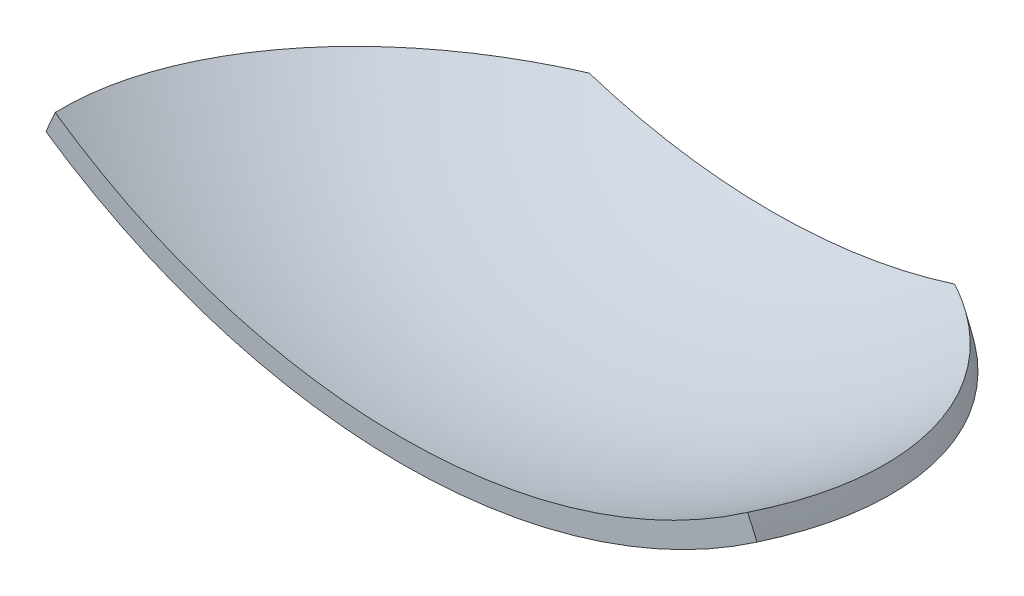
ISO-10303-21;
HEADER;
FILE_DESCRIPTION(('STEP AP214'),'2;1');
FILE_NAME('part.step','',(''),(''),'','','');
FILE_SCHEMA(('AUTOMOTIVE_DESIGN { 1 0 10303 214 1 1 1 1 }'));
ENDSEC;
DATA;
#1=APPLICATION_CONTEXT('core data for automotive mechanical design processes');
#2=APPLICATION_PROTOCOL_DEFINITION('international standard','automotive_design',2000,#1);
#3=PRODUCT_CONTEXT('',#1,'mechanical');
#4=PRODUCT('Part','Part','',(#3));
#5=PRODUCT_RELATED_PRODUCT_CATEGORY('part','',(#4));
#6=PRODUCT_DEFINITION_FORMATION('','',#4);
#7=PRODUCT_DEFINITION_CONTEXT('part definition',#1,'design');
#8=PRODUCT_DEFINITION('design','',#6,#7);
#9=PRODUCT_DEFINITION_SHAPE('','',#8);
#10=(LENGTH_UNIT() NAMED_UNIT(*) SI_UNIT(.MILLI.,.METRE.));
#11=(NAMED_UNIT(*) PLANE_ANGLE_UNIT() SI_UNIT($,.RADIAN.));
#12=(NAMED_UNIT(*) SI_UNIT($,.STERADIAN.) SOLID_ANGLE_UNIT());
#13=UNCERTAINTY_MEASURE_WITH_UNIT(LENGTH_MEASURE(1.E-05),#10,'distance_accuracy_value','');
#14=(GEOMETRIC_REPRESENTATION_CONTEXT(3) GLOBAL_UNCERTAINTY_ASSIGNED_CONTEXT((#13)) GLOBAL_UNIT_ASSIGNED_CONTEXT((#10,
#11,#12)) REPRESENTATION_CONTEXT('',''));
#15=CARTESIAN_POINT('',(0.,0.,0.));
#16=DIRECTION('',(0.,0.,1.));
#17=DIRECTION('',(1.,0.,0.));
#18=AXIS2_PLACEMENT_3D('',#15,#16,#17);
#19=CARTESIAN_POINT('',(0.,2.33601533610908,48.8188744450867));
#20=DIRECTION('',(0.,0.,1.));
#21=DIRECTION('',(1.,0.,0.));
#22=AXIS2_PLACEMENT_3D('',#19,#20,#21);
#23=SPHERICAL_SURFACE('',#22,22.);
#24=CARTESIAN_POINT('',(0.,2.33601533610908,42.));
#25=DIRECTION('',(0.,0.,-1.));
#26=DIRECTION('',(0.,-1.,0.));
#27=AXIS2_PLACEMENT_3D('',#24,#25,#26);
#28=CIRCLE('',#27,20.9165712128482);
#29=CARTESIAN_POINT('',(6.48098645908672,-17.5511605775114,42.));
#30=VERTEX_POINT('',#29);
#31=CARTESIAN_POINT('',(-6.48098645908672,-17.5511605775114,42.));
#32=VERTEX_POINT('',#31);
#33=EDGE_CURVE('E73',#30,#32,#28,.T.);
#34=ORIENTED_EDGE('',*,*,#33,.F.);
#35=CARTESIAN_POINT('',(0.,-15.6446623763601,52.1847152160109));
#36=DIRECTION('',(0.,0.98292696233335,-0.183996159520064));
#37=DIRECTION('',(0.,-0.183996159520064,-0.98292696233335));
#38=AXIS2_PLACEMENT_3D('',#35,#36,#37);
#39=CIRCLE('',#38,12.2215524752424);
#40=CARTESIAN_POINT('',(11.9924127306062,-15.2112593619206,54.5));
#41=VERTEX_POINT('',#40);
#42=EDGE_CURVE('E11',#41,#30,#39,.T.);
#43=ORIENTED_EDGE('',*,*,#42,.F.);
#44=CARTESIAN_POINT('',(0.,2.33601533610908,54.5));
#45=DIRECTION('',(0.,0.,1.));
#46=DIRECTION('',(0.,1.,0.));
#47=AXIS2_PLACEMENT_3D('',#44,#45,#46);
#48=CIRCLE('',#47,21.2538187728539);
#49=CARTESIAN_POINT('',(-11.9924127306062,-15.2112593619206,54.5));
#50=VERTEX_POINT('',#49);
#51=EDGE_CURVE('E80',#50,#41,#48,.T.);
#52=ORIENTED_EDGE('',*,*,#51,.F.);
#53=CARTESIAN_POINT('',(0.,-15.6446623763601,52.1847152160109));
#54=DIRECTION('',(0.,0.98292696233335,-0.183996159520064));
#55=DIRECTION('',(0.,-0.183996159520064,-0.98292696233335));
#56=AXIS2_PLACEMENT_3D('',#53,#54,#55);
#57=CIRCLE('',#56,12.2215524752424);
#58=EDGE_CURVE('E94',#32,#50,#57,.T.);
#59=ORIENTED_EDGE('',*,*,#58,.F.);
#60=EDGE_LOOP('',(#34,#43,#52,#59));
#61=FACE_BOUND('',#60,.T.);
#62=ADVANCED_FACE('F17',(#61),#23,.T.);
#63=CARTESIAN_POINT('',(0.,2.33601533610908,48.8188744450867));
#64=DIRECTION('',(0.,0.,1.));
#65=DIRECTION('',(1.,0.,0.));
#66=AXIS2_PLACEMENT_3D('',#63,#64,#65);
#67=SPHERICAL_SURFACE('',#66,21.2602916254687);
#68=CARTESIAN_POINT('',(0.,2.33601533610908,42.));
#69=DIRECTION('',(0.,0.,1.));
#70=DIRECTION('',(0.,-1.,0.));
#71=AXIS2_PLACEMENT_3D('',#68,#69,#70);
#72=CIRCLE('',#71,20.1371038459387);
#73=CARTESIAN_POINT('',(-6.16292873441596,-16.8348286911274,42.));
#74=VERTEX_POINT('',#73);
#75=CARTESIAN_POINT('',(6.16292873441596,-16.8348286911274,42.));
#76=VERTEX_POINT('',#75);
#77=EDGE_CURVE('E96',#74,#76,#72,.T.);
#78=ORIENTED_EDGE('',*,*,#77,.F.);
#79=CARTESIAN_POINT('',(0.,-14.9525816099428,52.0551631658808));
#80=DIRECTION('',(0.,-0.98292696233335,0.183996159520064));
#81=DIRECTION('',(0.,0.183996159520064,0.98292696233335));
#82=AXIS2_PLACEMENT_3D('',#79,#80,#81);
#83=CIRCLE('',#82,11.9428158720045);
#84=CARTESIAN_POINT('',(-11.6809321760037,-14.4949274755366,54.5));
#85=VERTEX_POINT('',#84);
#86=EDGE_CURVE('E21',#85,#74,#83,.T.);
#87=ORIENTED_EDGE('',*,*,#86,.F.);
#88=CARTESIAN_POINT('',(0.,2.33601533610908,54.5));
#89=DIRECTION('',(0.,0.,-1.));
#90=DIRECTION('',(0.,1.,0.));
#91=AXIS2_PLACEMENT_3D('',#88,#89,#90);
#92=CIRCLE('',#91,20.4871865425511);
#93=CARTESIAN_POINT('',(11.6809321760037,-14.4949274755366,54.5));
#94=VERTEX_POINT('',#93);
#95=EDGE_CURVE('E78',#94,#85,#92,.T.);
#96=ORIENTED_EDGE('',*,*,#95,.F.);
#97=CARTESIAN_POINT('',(0.,-14.9525816099428,52.0551631658808));
#98=DIRECTION('',(0.,-0.98292696233335,0.183996159520064));
#99=DIRECTION('',(0.,0.183996159520064,0.98292696233335));
#100=AXIS2_PLACEMENT_3D('',#97,#98,#99);
#101=CIRCLE('',#100,11.9428158720045);
#102=EDGE_CURVE('E28',#76,#94,#101,.T.);
#103=ORIENTED_EDGE('',*,*,#102,.F.);
#104=EDGE_LOOP('',(#78,#87,#96,#103));
#105=FACE_BOUND('',#104,.T.);
#106=ADVANCED_FACE('F83',(#105),#67,.F.);
#107=CARTESIAN_POINT('',(0.,-20.,53.));
#108=DIRECTION('',(0.,0.,1.));
#109=DIRECTION('',(1.,0.,0.));
#110=AXIS2_PLACEMENT_3D('',#107,#108,#109);
#111=SPHERICAL_SURFACE('',#110,13.);
#112=ORIENTED_EDGE('',*,*,#102,.T.);
#113=CARTESIAN_POINT('',(0.,-20.,54.5));
#114=DIRECTION('',(0.,0.,1.));
#115=DIRECTION('',(1.,0.,0.));
#116=AXIS2_PLACEMENT_3D('',#113,#114,#115);
#117=CIRCLE('',#116,12.913171570145);
#118=EDGE_CURVE('E65',#41,#94,#117,.T.);
#119=ORIENTED_EDGE('',*,*,#118,.F.);
#120=ORIENTED_EDGE('',*,*,#42,.T.);
#121=CARTESIAN_POINT('',(0.,-20.,42.));
#122=DIRECTION('',(0.,0.,1.));
#123=DIRECTION('',(1.,0.,0.));
#124=AXIS2_PLACEMENT_3D('',#121,#122,#123);
#125=CIRCLE('',#124,6.9282032302755);
#126=EDGE_CURVE('E68',#30,#76,#125,.T.);
#127=ORIENTED_EDGE('',*,*,#126,.T.);
#128=EDGE_LOOP('',(#112,#119,#120,#127));
#129=FACE_BOUND('',#128,.T.);
#130=ADVANCED_FACE('F64',(#129),#111,.T.);
#131=CARTESIAN_POINT('',(6.9282032302755,-20.,42.));
#132=DIRECTION('',(0.,0.,-1.));
#133=DIRECTION('',(0.,-1.,0.));
#134=AXIS2_PLACEMENT_3D('',#131,#132,#133);
#135=PLANE('',#134);
#136=ORIENTED_EDGE('',*,*,#77,.T.);
#137=ORIENTED_EDGE('',*,*,#126,.F.);
#138=ORIENTED_EDGE('',*,*,#33,.T.);
#139=CARTESIAN_POINT('',(0.,-20.,42.));
#140=DIRECTION('',(0.,0.,1.));
#141=DIRECTION('',(1.,0.,0.));
#142=AXIS2_PLACEMENT_3D('',#139,#140,#141);
#143=CIRCLE('',#142,6.9282032302755);
#144=EDGE_CURVE('E97',#74,#32,#143,.T.);
#145=ORIENTED_EDGE('',*,*,#144,.F.);
#146=EDGE_LOOP('',(#136,#137,#138,#145));
#147=FACE_BOUND('',#146,.T.);
#148=ADVANCED_FACE('F125',(#147),#135,.T.);
#149=CARTESIAN_POINT('',(0.,-20.,53.));
#150=DIRECTION('',(0.,0.,1.));
#151=DIRECTION('',(1.,0.,0.));
#152=AXIS2_PLACEMENT_3D('',#149,#150,#151);
#153=SPHERICAL_SURFACE('',#152,13.);
#154=ORIENTED_EDGE('',*,*,#86,.T.);
#155=ORIENTED_EDGE('',*,*,#144,.T.);
#156=ORIENTED_EDGE('',*,*,#58,.T.);
#157=CARTESIAN_POINT('',(0.,-20.,54.5));
#158=DIRECTION('',(0.,0.,1.));
#159=DIRECTION('',(1.,0.,0.));
#160=AXIS2_PLACEMENT_3D('',#157,#158,#159);
#161=CIRCLE('',#160,12.913171570145);
#162=EDGE_CURVE('E87',#85,#50,#161,.T.);
#163=ORIENTED_EDGE('',*,*,#162,.F.);
#164=EDGE_LOOP('',(#154,#155,#156,#163));
#165=FACE_BOUND('',#164,.T.);
#166=ADVANCED_FACE('F127',(#165),#153,.T.);
#167=CARTESIAN_POINT('',(0.,-20.,54.5));
#168=DIRECTION('',(0.,0.,1.));
#169=DIRECTION('',(1.,0.,0.));
#170=AXIS2_PLACEMENT_3D('',#167,#168,#169);
#171=PLANE('',#170);
#172=ORIENTED_EDGE('',*,*,#95,.T.);
#173=ORIENTED_EDGE('',*,*,#162,.T.);
#174=ORIENTED_EDGE('',*,*,#51,.T.);
#175=ORIENTED_EDGE('',*,*,#118,.T.);
#176=EDGE_LOOP('',(#172,#173,#174,#175));
#177=FACE_BOUND('',#176,.T.);
#178=ADVANCED_FACE('F19',(#177),#171,.T.);
#179=CLOSED_SHELL('',(#62,#106,#130,#148,#166,#178));
#180=MANIFOLD_SOLID_BREP('B1',#179);
#181=ADVANCED_BREP_SHAPE_REPRESENTATION('',(#18,#180),#14);
#182=SHAPE_DEFINITION_REPRESENTATION(#9,#181);
ENDSEC;
END-ISO-10303-21;
